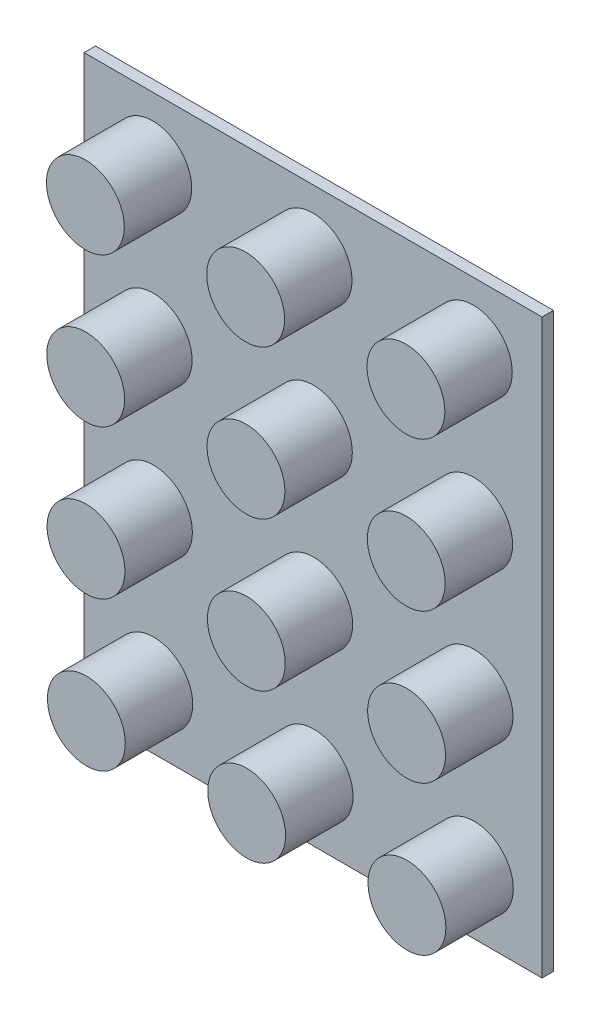
ISO-10303-21;
HEADER;
FILE_DESCRIPTION(('STEP AP214'),'2;1');
FILE_NAME('part.step','',(''),(''),'','','');
FILE_SCHEMA(('AUTOMOTIVE_DESIGN { 1 0 10303 214 1 1 1 1 }'));
ENDSEC;
DATA;
#1=APPLICATION_CONTEXT('core data for automotive mechanical design processes');
#2=APPLICATION_PROTOCOL_DEFINITION('international standard','automotive_design',2000,#1);
#3=PRODUCT_CONTEXT('',#1,'mechanical');
#4=PRODUCT('Part','Part','',(#3));
#5=PRODUCT_RELATED_PRODUCT_CATEGORY('part','',(#4));
#6=PRODUCT_DEFINITION_FORMATION('','',#4);
#7=PRODUCT_DEFINITION_CONTEXT('part definition',#1,'design');
#8=PRODUCT_DEFINITION('design','',#6,#7);
#9=PRODUCT_DEFINITION_SHAPE('','',#8);
#10=(LENGTH_UNIT() NAMED_UNIT(*) SI_UNIT(.MILLI.,.METRE.));
#11=(NAMED_UNIT(*) PLANE_ANGLE_UNIT() SI_UNIT($,.RADIAN.));
#12=(NAMED_UNIT(*) SI_UNIT($,.STERADIAN.) SOLID_ANGLE_UNIT());
#13=UNCERTAINTY_MEASURE_WITH_UNIT(LENGTH_MEASURE(1.E-05),#10,'distance_accuracy_value','');
#14=(GEOMETRIC_REPRESENTATION_CONTEXT(3) GLOBAL_UNCERTAINTY_ASSIGNED_CONTEXT((#13)) GLOBAL_UNIT_ASSIGNED_CONTEXT((#10,
#11,#12)) REPRESENTATION_CONTEXT('',''));
#15=CARTESIAN_POINT('',(0.,0.,0.));
#16=DIRECTION('',(0.,0.,1.));
#17=DIRECTION('',(1.,0.,0.));
#18=AXIS2_PLACEMENT_3D('',#15,#16,#17);
#19=CARTESIAN_POINT('',(14.05873023517,-6.503966793782,6.91));
#20=DIRECTION('',(0.,0.,1.));
#21=DIRECTION('',(1.,0.,0.));
#22=AXIS2_PLACEMENT_3D('',#19,#20,#21);
#23=PLANE('',#22);
#24=CARTESIAN_POINT('',(14.05873023517,-6.503966793782,6.91));
#25=DIRECTION('',(0.,0.,1.));
#26=DIRECTION('',(1.,0.,0.));
#27=AXIS2_PLACEMENT_3D('',#24,#25,#26);
#28=CIRCLE('',#27,3.4);
#29=CARTESIAN_POINT('',(17.45873023517,-6.503966793782,6.91));
#30=VERTEX_POINT('',#29);
#31=EDGE_CURVE('E11',#30,#30,#28,.T.);
#32=ORIENTED_EDGE('',*,*,#31,.T.);
#33=EDGE_LOOP('',(#32));
#34=FACE_BOUND('',#33,.T.);
#35=ADVANCED_FACE('F16',(#34),#23,.T.);
#36=CARTESIAN_POINT('',(14.088113233026,-19.50393358756,6.91));
#37=DIRECTION('',(0.,0.,1.));
#38=DIRECTION('',(1.,0.,0.));
#39=AXIS2_PLACEMENT_3D('',#36,#37,#38);
#40=PLANE('',#39);
#41=CARTESIAN_POINT('',(14.088113233026,-19.50393358756,6.91));
#42=DIRECTION('',(0.,0.,1.));
#43=DIRECTION('',(1.,0.,0.));
#44=AXIS2_PLACEMENT_3D('',#41,#42,#43);
#45=CIRCLE('',#44,3.4);
#46=CARTESIAN_POINT('',(17.488113233026,-19.50393358756,6.91));
#47=VERTEX_POINT('',#46);
#48=EDGE_CURVE('E45',#47,#47,#45,.T.);
#49=ORIENTED_EDGE('',*,*,#48,.T.);
#50=EDGE_LOOP('',(#49));
#51=FACE_BOUND('',#50,.T.);
#52=ADVANCED_FACE('F399',(#51),#40,.T.);
#53=CARTESIAN_POINT('',(14.029347237314,6.496,6.91));
#54=DIRECTION('',(0.,0.,1.));
#55=DIRECTION('',(1.,0.,0.));
#56=AXIS2_PLACEMENT_3D('',#53,#54,#55);
#57=PLANE('',#56);
#58=CARTESIAN_POINT('',(14.029347237314,6.496,6.91));
#59=DIRECTION('',(0.,0.,1.));
#60=DIRECTION('',(1.,0.,0.));
#61=AXIS2_PLACEMENT_3D('',#58,#59,#60);
#62=CIRCLE('',#61,3.4);
#63=CARTESIAN_POINT('',(17.429347237314,6.496,6.91));
#64=VERTEX_POINT('',#63);
#65=EDGE_CURVE('E211',#64,#64,#62,.T.);
#66=ORIENTED_EDGE('',*,*,#65,.T.);
#67=EDGE_LOOP('',(#66));
#68=FACE_BOUND('',#67,.T.);
#69=ADVANCED_FACE('F404',(#68),#57,.T.);
#70=CARTESIAN_POINT('',(13.999964239458,19.495966793782,6.91));
#71=DIRECTION('',(0.,0.,1.));
#72=DIRECTION('',(1.,0.,0.));
#73=AXIS2_PLACEMENT_3D('',#70,#71,#72);
#74=PLANE('',#73);
#75=CARTESIAN_POINT('',(13.999964239458,19.495966793782,6.91));
#76=DIRECTION('',(0.,0.,1.));
#77=DIRECTION('',(1.,0.,0.));
#78=AXIS2_PLACEMENT_3D('',#75,#76,#77);
#79=CIRCLE('',#78,3.4);
#80=CARTESIAN_POINT('',(17.399964239458,19.495966793782,6.91));
#81=VERTEX_POINT('',#80);
#82=EDGE_CURVE('E322',#81,#81,#79,.T.);
#83=ORIENTED_EDGE('',*,*,#82,.T.);
#84=EDGE_LOOP('',(#83));
#85=FACE_BOUND('',#84,.T.);
#86=ADVANCED_FACE('F445',(#85),#74,.T.);
#87=CARTESIAN_POINT('',(0.,19.464323565322,6.91));
#88=DIRECTION('',(0.,0.,1.));
#89=DIRECTION('',(1.,0.,0.));
#90=AXIS2_PLACEMENT_3D('',#87,#88,#89);
#91=PLANE('',#90);
#92=CARTESIAN_POINT('',(0.,19.464323565322,6.91));
#93=DIRECTION('',(0.,0.,1.));
#94=DIRECTION('',(1.,0.,0.));
#95=AXIS2_PLACEMENT_3D('',#92,#93,#94);
#96=CIRCLE('',#95,3.4);
#97=CARTESIAN_POINT('',(3.4,19.464323565322,6.91));
#98=VERTEX_POINT('',#97);
#99=EDGE_CURVE('E238',#98,#98,#96,.T.);
#100=ORIENTED_EDGE('',*,*,#99,.T.);
#101=EDGE_LOOP('',(#100));
#102=FACE_BOUND('',#101,.T.);
#103=ADVANCED_FACE('F437',(#102),#91,.T.);
#104=CARTESIAN_POINT('',(-13.99996423945,19.432680336861,6.91));
#105=DIRECTION('',(0.,0.,1.));
#106=DIRECTION('',(1.,0.,0.));
#107=AXIS2_PLACEMENT_3D('',#104,#105,#106);
#108=PLANE('',#107);
#109=CARTESIAN_POINT('',(-13.99996423945,19.432680336861,6.91));
#110=DIRECTION('',(0.,0.,1.));
#111=DIRECTION('',(1.,0.,0.));
#112=AXIS2_PLACEMENT_3D('',#109,#110,#111);
#113=CIRCLE('',#112,3.4);
#114=CARTESIAN_POINT('',(-10.59996423945,19.432680336861,6.91));
#115=VERTEX_POINT('',#114);
#116=EDGE_CURVE('E231',#115,#115,#113,.T.);
#117=ORIENTED_EDGE('',*,*,#116,.T.);
#118=EDGE_LOOP('',(#117));
#119=FACE_BOUND('',#118,.T.);
#120=ADVANCED_FACE('F435',(#119),#108,.T.);
#121=CARTESIAN_POINT('',(0.08814899356863,-19.53557681602,6.91));
#122=DIRECTION('',(0.,0.,1.));
#123=DIRECTION('',(1.,0.,0.));
#124=AXIS2_PLACEMENT_3D('',#121,#122,#123);
#125=PLANE('',#124);
#126=CARTESIAN_POINT('',(0.08814899356863,-19.53557681602,6.91));
#127=DIRECTION('',(0.,0.,1.));
#128=DIRECTION('',(1.,0.,0.));
#129=AXIS2_PLACEMENT_3D('',#126,#127,#128);
#130=CIRCLE('',#129,3.4);
#131=CARTESIAN_POINT('',(3.488148993569,-19.53557681602,6.91));
#132=VERTEX_POINT('',#131);
#133=EDGE_CURVE('E232',#132,#132,#130,.T.);
#134=ORIENTED_EDGE('',*,*,#133,.T.);
#135=EDGE_LOOP('',(#134));
#136=FACE_BOUND('',#135,.T.);
#137=ADVANCED_FACE('F362',(#136),#125,.T.);
#138=CARTESIAN_POINT('',(0.02938299785621,6.464356771539,6.91));
#139=DIRECTION('',(0.,0.,1.));
#140=DIRECTION('',(1.,0.,0.));
#141=AXIS2_PLACEMENT_3D('',#138,#139,#140);
#142=PLANE('',#141);
#143=CARTESIAN_POINT('',(0.02938299785621,6.464356771539,6.91));
#144=DIRECTION('',(0.,0.,1.));
#145=DIRECTION('',(1.,0.,0.));
#146=AXIS2_PLACEMENT_3D('',#143,#144,#145);
#147=CIRCLE('',#146,3.4);
#148=CARTESIAN_POINT('',(3.429382997856,6.464356771539,6.91));
#149=VERTEX_POINT('',#148);
#150=EDGE_CURVE('E246',#149,#149,#147,.T.);
#151=ORIENTED_EDGE('',*,*,#150,.T.);
#152=EDGE_LOOP('',(#151));
#153=FACE_BOUND('',#152,.T.);
#154=ADVANCED_FACE('F443',(#153),#142,.T.);
#155=CARTESIAN_POINT('',(0.05876599571242,-6.535610022243,6.91));
#156=DIRECTION('',(0.,0.,1.));
#157=DIRECTION('',(1.,0.,0.));
#158=AXIS2_PLACEMENT_3D('',#155,#156,#157);
#159=PLANE('',#158);
#160=CARTESIAN_POINT('',(0.05876599571242,-6.535610022243,6.91));
#161=DIRECTION('',(0.,0.,1.));
#162=DIRECTION('',(1.,0.,0.));
#163=AXIS2_PLACEMENT_3D('',#160,#161,#162);
#164=CIRCLE('',#163,3.4);
#165=CARTESIAN_POINT('',(3.458765995712,-6.535610022243,6.91));
#166=VERTEX_POINT('',#165);
#167=EDGE_CURVE('E311',#166,#166,#164,.T.);
#168=ORIENTED_EDGE('',*,*,#167,.T.);
#169=EDGE_LOOP('',(#168));
#170=FACE_BOUND('',#169,.T.);
#171=ADVANCED_FACE('F464',(#170),#159,.T.);
#172=CARTESIAN_POINT('',(-13.9705812416,6.432713543079,6.91));
#173=DIRECTION('',(0.,0.,1.));
#174=DIRECTION('',(1.,0.,0.));
#175=AXIS2_PLACEMENT_3D('',#172,#173,#174);
#176=PLANE('',#175);
#177=CARTESIAN_POINT('',(-13.9705812416,6.432713543079,6.91));
#178=DIRECTION('',(0.,0.,1.));
#179=DIRECTION('',(1.,0.,0.));
#180=AXIS2_PLACEMENT_3D('',#177,#178,#179);
#181=CIRCLE('',#180,3.4);
#182=CARTESIAN_POINT('',(-10.5705812416,6.432713543079,6.91));
#183=VERTEX_POINT('',#182);
#184=EDGE_CURVE('E222',#183,#183,#181,.T.);
#185=ORIENTED_EDGE('',*,*,#184,.T.);
#186=EDGE_LOOP('',(#185));
#187=FACE_BOUND('',#186,.T.);
#188=ADVANCED_FACE('F408',(#187),#176,.T.);
#189=CARTESIAN_POINT('',(-13.94119824374,-6.567253250703,6.91));
#190=DIRECTION('',(0.,0.,1.));
#191=DIRECTION('',(1.,0.,0.));
#192=AXIS2_PLACEMENT_3D('',#189,#190,#191);
#193=PLANE('',#192);
#194=CARTESIAN_POINT('',(-13.94119824374,-6.567253250703,6.91));
#195=DIRECTION('',(0.,0.,1.));
#196=DIRECTION('',(1.,0.,0.));
#197=AXIS2_PLACEMENT_3D('',#194,#195,#196);
#198=CIRCLE('',#197,3.4);
#199=CARTESIAN_POINT('',(-10.54119824374,-6.567253250703,6.91));
#200=VERTEX_POINT('',#199);
#201=EDGE_CURVE('E300',#200,#200,#198,.T.);
#202=ORIENTED_EDGE('',*,*,#201,.T.);
#203=EDGE_LOOP('',(#202));
#204=FACE_BOUND('',#203,.T.);
#205=ADVANCED_FACE('F471',(#204),#193,.T.);
#206=CARTESIAN_POINT('',(-13.91181524588,-19.56722004448,6.91));
#207=DIRECTION('',(0.,0.,1.));
#208=DIRECTION('',(1.,0.,0.));
#209=AXIS2_PLACEMENT_3D('',#206,#207,#208);
#210=PLANE('',#209);
#211=CARTESIAN_POINT('',(-13.91181524588,-19.56722004448,6.91));
#212=DIRECTION('',(0.,0.,1.));
#213=DIRECTION('',(1.,0.,0.));
#214=AXIS2_PLACEMENT_3D('',#211,#212,#213);
#215=CIRCLE('',#214,3.4);
#216=CARTESIAN_POINT('',(-10.51181524588,-19.56722004448,6.91));
#217=VERTEX_POINT('',#216);
#218=EDGE_CURVE('E98',#217,#217,#215,.T.);
#219=ORIENTED_EDGE('',*,*,#218,.T.);
#220=EDGE_LOOP('',(#219));
#221=FACE_BOUND('',#220,.T.);
#222=ADVANCED_FACE('F482',(#221),#210,.T.);
#223=CARTESIAN_POINT('',(14.05873023517,-6.503966793782,1.02));
#224=DIRECTION('',(0.,0.,-1.));
#225=DIRECTION('',(1.,0.,0.));
#226=AXIS2_PLACEMENT_3D('',#223,#224,#225);
#227=CYLINDRICAL_SURFACE('',#226,3.4);
#228=CARTESIAN_POINT('',(14.05873023517,-6.503966793782,1.02));
#229=DIRECTION('',(0.,0.,1.));
#230=DIRECTION('',(1.,0.,0.));
#231=AXIS2_PLACEMENT_3D('',#228,#229,#230);
#232=CIRCLE('',#231,3.4);
#233=CARTESIAN_POINT('',(17.45873023517,-6.503966793782,1.02));
#234=VERTEX_POINT('',#233);
#235=EDGE_CURVE('E251',#234,#234,#232,.T.);
#236=ORIENTED_EDGE('',*,*,#235,.T.);
#237=DIRECTION('',(0.,0.,1.));
#238=VECTOR('',#237,1.);
#239=CARTESIAN_POINT('',(17.45873023517,-6.503966793782,1.02));
#240=LINE('',#239,#238);
#241=EDGE_CURVE('E26',#234,#30,#240,.T.);
#242=ORIENTED_EDGE('',*,*,#241,.T.);
#243=ORIENTED_EDGE('',*,*,#31,.F.);
#244=ORIENTED_EDGE('',*,*,#241,.F.);
#245=EDGE_LOOP('',(#236,#242,#243,#244));
#246=FACE_BOUND('',#245,.T.);
#247=ADVANCED_FACE('F487',(#246),#227,.T.);
#248=CARTESIAN_POINT('',(14.088113233026,-19.50393358756,1.02));
#249=DIRECTION('',(0.,0.,-1.));
#250=DIRECTION('',(1.,0.,0.));
#251=AXIS2_PLACEMENT_3D('',#248,#249,#250);
#252=CYLINDRICAL_SURFACE('',#251,3.4);
#253=CARTESIAN_POINT('',(14.088113233026,-19.50393358756,1.02));
#254=DIRECTION('',(0.,0.,1.));
#255=DIRECTION('',(1.,0.,0.));
#256=AXIS2_PLACEMENT_3D('',#253,#254,#255);
#257=CIRCLE('',#256,3.4);
#258=CARTESIAN_POINT('',(17.488113233026,-19.50393358756,1.02));
#259=VERTEX_POINT('',#258);
#260=EDGE_CURVE('E255',#259,#259,#257,.T.);
#261=ORIENTED_EDGE('',*,*,#260,.T.);
#262=DIRECTION('',(0.,0.,1.));
#263=VECTOR('',#262,1.);
#264=CARTESIAN_POINT('',(17.488113233026,-19.50393358756,1.02));
#265=LINE('',#264,#263);
#266=EDGE_CURVE('E235',#259,#47,#265,.T.);
#267=ORIENTED_EDGE('',*,*,#266,.T.);
#268=ORIENTED_EDGE('',*,*,#48,.F.);
#269=ORIENTED_EDGE('',*,*,#266,.F.);
#270=EDGE_LOOP('',(#261,#267,#268,#269));
#271=FACE_BOUND('',#270,.T.);
#272=ADVANCED_FACE('F18',(#271),#252,.T.);
#273=CARTESIAN_POINT('',(14.029347237314,6.496,1.02));
#274=DIRECTION('',(0.,0.,-1.));
#275=DIRECTION('',(1.,0.,0.));
#276=AXIS2_PLACEMENT_3D('',#273,#274,#275);
#277=CYLINDRICAL_SURFACE('',#276,3.4);
#278=CARTESIAN_POINT('',(14.029347237314,6.496,1.02));
#279=DIRECTION('',(0.,0.,1.));
#280=DIRECTION('',(1.,0.,0.));
#281=AXIS2_PLACEMENT_3D('',#278,#279,#280);
#282=CIRCLE('',#281,3.4);
#283=CARTESIAN_POINT('',(17.429347237314,6.496,1.02));
#284=VERTEX_POINT('',#283);
#285=EDGE_CURVE('E20',#284,#284,#282,.T.);
#286=ORIENTED_EDGE('',*,*,#285,.T.);
#287=DIRECTION('',(0.,0.,1.));
#288=VECTOR('',#287,1.);
#289=CARTESIAN_POINT('',(17.429347237314,6.496,1.02));
#290=LINE('',#289,#288);
#291=EDGE_CURVE('E319',#284,#64,#290,.T.);
#292=ORIENTED_EDGE('',*,*,#291,.T.);
#293=ORIENTED_EDGE('',*,*,#65,.F.);
#294=ORIENTED_EDGE('',*,*,#291,.F.);
#295=EDGE_LOOP('',(#286,#292,#293,#294));
#296=FACE_BOUND('',#295,.T.);
#297=ADVANCED_FACE('F417',(#296),#277,.T.);
#298=CARTESIAN_POINT('',(13.999964239458,19.495966793782,1.02));
#299=DIRECTION('',(0.,0.,-1.));
#300=DIRECTION('',(1.,0.,0.));
#301=AXIS2_PLACEMENT_3D('',#298,#299,#300);
#302=CYLINDRICAL_SURFACE('',#301,3.4);
#303=CARTESIAN_POINT('',(13.999964239458,19.495966793782,1.02));
#304=DIRECTION('',(0.,0.,1.));
#305=DIRECTION('',(1.,0.,0.));
#306=AXIS2_PLACEMENT_3D('',#303,#304,#305);
#307=CIRCLE('',#306,3.4);
#308=CARTESIAN_POINT('',(17.399964239458,19.495966793782,1.02));
#309=VERTEX_POINT('',#308);
#310=EDGE_CURVE('E303',#309,#309,#307,.T.);
#311=ORIENTED_EDGE('',*,*,#310,.T.);
#312=DIRECTION('',(0.,0.,1.));
#313=VECTOR('',#312,1.);
#314=CARTESIAN_POINT('',(17.399964239458,19.495966793782,1.02));
#315=LINE('',#314,#313);
#316=EDGE_CURVE('E241',#309,#81,#315,.T.);
#317=ORIENTED_EDGE('',*,*,#316,.T.);
#318=ORIENTED_EDGE('',*,*,#82,.F.);
#319=ORIENTED_EDGE('',*,*,#316,.F.);
#320=EDGE_LOOP('',(#311,#317,#318,#319));
#321=FACE_BOUND('',#320,.T.);
#322=ADVANCED_FACE('F414',(#321),#302,.T.);
#323=CARTESIAN_POINT('',(0.,19.464323565322,1.02));
#324=DIRECTION('',(0.,0.,-1.));
#325=DIRECTION('',(1.,0.,0.));
#326=AXIS2_PLACEMENT_3D('',#323,#324,#325);
#327=CYLINDRICAL_SURFACE('',#326,3.4);
#328=CARTESIAN_POINT('',(0.,19.464323565322,1.02));
#329=DIRECTION('',(0.,0.,1.));
#330=DIRECTION('',(1.,0.,0.));
#331=AXIS2_PLACEMENT_3D('',#328,#329,#330);
#332=CIRCLE('',#331,3.4);
#333=CARTESIAN_POINT('',(3.4,19.464323565322,1.02));
#334=VERTEX_POINT('',#333);
#335=EDGE_CURVE('E270',#334,#334,#332,.T.);
#336=ORIENTED_EDGE('',*,*,#335,.T.);
#337=DIRECTION('',(0.,0.,1.));
#338=VECTOR('',#337,1.);
#339=CARTESIAN_POINT('',(3.4,19.464323565322,1.02));
#340=LINE('',#339,#338);
#341=EDGE_CURVE('E242',#334,#98,#340,.T.);
#342=ORIENTED_EDGE('',*,*,#341,.T.);
#343=ORIENTED_EDGE('',*,*,#99,.F.);
#344=ORIENTED_EDGE('',*,*,#341,.F.);
#345=EDGE_LOOP('',(#336,#342,#343,#344));
#346=FACE_BOUND('',#345,.T.);
#347=ADVANCED_FACE('F416',(#346),#327,.T.);
#348=CARTESIAN_POINT('',(-13.99996423945,19.432680336861,1.02));
#349=DIRECTION('',(0.,0.,-1.));
#350=DIRECTION('',(1.,0.,0.));
#351=AXIS2_PLACEMENT_3D('',#348,#349,#350);
#352=CYLINDRICAL_SURFACE('',#351,3.4);
#353=CARTESIAN_POINT('',(-13.99996423945,19.432680336861,1.02));
#354=DIRECTION('',(0.,0.,1.));
#355=DIRECTION('',(1.,0.,0.));
#356=AXIS2_PLACEMENT_3D('',#353,#354,#355);
#357=CIRCLE('',#356,3.4);
#358=CARTESIAN_POINT('',(-10.59996423945,19.432680336861,1.02));
#359=VERTEX_POINT('',#358);
#360=EDGE_CURVE('E266',#359,#359,#357,.T.);
#361=ORIENTED_EDGE('',*,*,#360,.T.);
#362=DIRECTION('',(0.,0.,1.));
#363=VECTOR('',#362,1.);
#364=CARTESIAN_POINT('',(-10.59996423945,19.432680336861,1.02));
#365=LINE('',#364,#363);
#366=EDGE_CURVE('E227',#359,#115,#365,.T.);
#367=ORIENTED_EDGE('',*,*,#366,.T.);
#368=ORIENTED_EDGE('',*,*,#116,.F.);
#369=ORIENTED_EDGE('',*,*,#366,.F.);
#370=EDGE_LOOP('',(#361,#367,#368,#369));
#371=FACE_BOUND('',#370,.T.);
#372=ADVANCED_FACE('F413',(#371),#352,.T.);
#373=CARTESIAN_POINT('',(0.08814899356863,-19.53557681602,1.02));
#374=DIRECTION('',(0.,0.,-1.));
#375=DIRECTION('',(1.,0.,0.));
#376=AXIS2_PLACEMENT_3D('',#373,#374,#375);
#377=CYLINDRICAL_SURFACE('',#376,3.4);
#378=CARTESIAN_POINT('',(0.08814899356863,-19.53557681602,1.02));
#379=DIRECTION('',(0.,0.,1.));
#380=DIRECTION('',(1.,0.,0.));
#381=AXIS2_PLACEMENT_3D('',#378,#379,#380);
#382=CIRCLE('',#381,3.4);
#383=CARTESIAN_POINT('',(3.488148993569,-19.53557681602,1.02));
#384=VERTEX_POINT('',#383);
#385=EDGE_CURVE('E271',#384,#384,#382,.T.);
#386=ORIENTED_EDGE('',*,*,#385,.T.);
#387=DIRECTION('',(0.,0.,1.));
#388=VECTOR('',#387,1.);
#389=CARTESIAN_POINT('',(3.488148993569,-19.53557681602,1.02));
#390=LINE('',#389,#388);
#391=EDGE_CURVE('E248',#384,#132,#390,.T.);
#392=ORIENTED_EDGE('',*,*,#391,.T.);
#393=ORIENTED_EDGE('',*,*,#133,.F.);
#394=ORIENTED_EDGE('',*,*,#391,.F.);
#395=EDGE_LOOP('',(#386,#392,#393,#394));
#396=FACE_BOUND('',#395,.T.);
#397=ADVANCED_FACE('F364',(#396),#377,.T.);
#398=CARTESIAN_POINT('',(0.02938299785621,6.464356771539,1.02));
#399=DIRECTION('',(0.,0.,-1.));
#400=DIRECTION('',(1.,0.,0.));
#401=AXIS2_PLACEMENT_3D('',#398,#399,#400);
#402=CYLINDRICAL_SURFACE('',#401,3.4);
#403=CARTESIAN_POINT('',(0.02938299785621,6.464356771539,1.02));
#404=DIRECTION('',(0.,0.,1.));
#405=DIRECTION('',(1.,0.,0.));
#406=AXIS2_PLACEMENT_3D('',#403,#404,#405);
#407=CIRCLE('',#406,3.4);
#408=CARTESIAN_POINT('',(3.429382997856,6.464356771539,1.02));
#409=VERTEX_POINT('',#408);
#410=EDGE_CURVE('E284',#409,#409,#407,.T.);
#411=ORIENTED_EDGE('',*,*,#410,.T.);
#412=DIRECTION('',(0.,0.,1.));
#413=VECTOR('',#412,1.);
#414=CARTESIAN_POINT('',(3.429382997856,6.464356771539,1.02));
#415=LINE('',#414,#413);
#416=EDGE_CURVE('E249',#409,#149,#415,.T.);
#417=ORIENTED_EDGE('',*,*,#416,.T.);
#418=ORIENTED_EDGE('',*,*,#150,.F.);
#419=ORIENTED_EDGE('',*,*,#416,.F.);
#420=EDGE_LOOP('',(#411,#417,#418,#419));
#421=FACE_BOUND('',#420,.T.);
#422=ADVANCED_FACE('F412',(#421),#402,.T.);
#423=CARTESIAN_POINT('',(0.05876599571242,-6.535610022243,1.02));
#424=DIRECTION('',(0.,0.,-1.));
#425=DIRECTION('',(1.,0.,0.));
#426=AXIS2_PLACEMENT_3D('',#423,#424,#425);
#427=CYLINDRICAL_SURFACE('',#426,3.4);
#428=CARTESIAN_POINT('',(0.05876599571242,-6.535610022243,1.02));
#429=DIRECTION('',(0.,0.,1.));
#430=DIRECTION('',(1.,0.,0.));
#431=AXIS2_PLACEMENT_3D('',#428,#429,#430);
#432=CIRCLE('',#431,3.4);
#433=CARTESIAN_POINT('',(3.458765995712,-6.535610022243,1.02));
#434=VERTEX_POINT('',#433);
#435=EDGE_CURVE('E310',#434,#434,#432,.T.);
#436=ORIENTED_EDGE('',*,*,#435,.T.);
#437=DIRECTION('',(0.,0.,1.));
#438=VECTOR('',#437,1.);
#439=CARTESIAN_POINT('',(3.458765995712,-6.535610022243,1.02));
#440=LINE('',#439,#438);
#441=EDGE_CURVE('E225',#434,#166,#440,.T.);
#442=ORIENTED_EDGE('',*,*,#441,.T.);
#443=ORIENTED_EDGE('',*,*,#167,.F.);
#444=ORIENTED_EDGE('',*,*,#441,.F.);
#445=EDGE_LOOP('',(#436,#442,#443,#444));
#446=FACE_BOUND('',#445,.T.);
#447=ADVANCED_FACE('F452',(#446),#427,.T.);
#448=CARTESIAN_POINT('',(-13.9705812416,6.432713543079,1.02));
#449=DIRECTION('',(0.,0.,-1.));
#450=DIRECTION('',(1.,0.,0.));
#451=AXIS2_PLACEMENT_3D('',#448,#449,#450);
#452=CYLINDRICAL_SURFACE('',#451,3.4);
#453=CARTESIAN_POINT('',(-13.9705812416,6.432713543079,1.02));
#454=DIRECTION('',(0.,0.,1.));
#455=DIRECTION('',(1.,0.,0.));
#456=AXIS2_PLACEMENT_3D('',#453,#454,#455);
#457=CIRCLE('',#456,3.4);
#458=CARTESIAN_POINT('',(-10.5705812416,6.432713543079,1.02));
#459=VERTEX_POINT('',#458);
#460=EDGE_CURVE('E217',#459,#459,#457,.T.);
#461=ORIENTED_EDGE('',*,*,#460,.T.);
#462=DIRECTION('',(0.,0.,1.));
#463=VECTOR('',#462,1.);
#464=CARTESIAN_POINT('',(-10.5705812416,6.432713543079,1.02));
#465=LINE('',#464,#463);
#466=EDGE_CURVE('E226',#459,#183,#465,.T.);
#467=ORIENTED_EDGE('',*,*,#466,.T.);
#468=ORIENTED_EDGE('',*,*,#184,.F.);
#469=ORIENTED_EDGE('',*,*,#466,.F.);
#470=EDGE_LOOP('',(#461,#467,#468,#469));
#471=FACE_BOUND('',#470,.T.);
#472=ADVANCED_FACE('F393',(#471),#452,.T.);
#473=CARTESIAN_POINT('',(-13.94119824374,-6.567253250703,1.02));
#474=DIRECTION('',(0.,0.,-1.));
#475=DIRECTION('',(1.,0.,0.));
#476=AXIS2_PLACEMENT_3D('',#473,#474,#475);
#477=CYLINDRICAL_SURFACE('',#476,3.4);
#478=CARTESIAN_POINT('',(-13.94119824374,-6.567253250703,1.02));
#479=DIRECTION('',(0.,0.,1.));
#480=DIRECTION('',(1.,0.,0.));
#481=AXIS2_PLACEMENT_3D('',#478,#479,#480);
#482=CIRCLE('',#481,3.4);
#483=CARTESIAN_POINT('',(-10.54119824374,-6.567253250703,1.02));
#484=VERTEX_POINT('',#483);
#485=EDGE_CURVE('E213',#484,#484,#482,.T.);
#486=ORIENTED_EDGE('',*,*,#485,.T.);
#487=DIRECTION('',(0.,0.,1.));
#488=VECTOR('',#487,1.);
#489=CARTESIAN_POINT('',(-10.54119824374,-6.567253250703,1.02));
#490=LINE('',#489,#488);
#491=EDGE_CURVE('E294',#484,#200,#490,.T.);
#492=ORIENTED_EDGE('',*,*,#491,.T.);
#493=ORIENTED_EDGE('',*,*,#201,.F.);
#494=ORIENTED_EDGE('',*,*,#491,.F.);
#495=EDGE_LOOP('',(#486,#492,#493,#494));
#496=FACE_BOUND('',#495,.T.);
#497=ADVANCED_FACE('F384',(#496),#477,.T.);
#498=CARTESIAN_POINT('',(-13.91181524588,-19.56722004448,1.02));
#499=DIRECTION('',(0.,0.,-1.));
#500=DIRECTION('',(1.,0.,0.));
#501=AXIS2_PLACEMENT_3D('',#498,#499,#500);
#502=CYLINDRICAL_SURFACE('',#501,3.4);
#503=CARTESIAN_POINT('',(-13.91181524588,-19.56722004448,1.02));
#504=DIRECTION('',(0.,0.,1.));
#505=DIRECTION('',(1.,0.,0.));
#506=AXIS2_PLACEMENT_3D('',#503,#504,#505);
#507=CIRCLE('',#506,3.4);
#508=CARTESIAN_POINT('',(-10.51181524588,-19.56722004448,1.02));
#509=VERTEX_POINT('',#508);
#510=EDGE_CURVE('E218',#509,#509,#507,.T.);
#511=ORIENTED_EDGE('',*,*,#510,.T.);
#512=DIRECTION('',(0.,0.,1.));
#513=VECTOR('',#512,1.);
#514=CARTESIAN_POINT('',(-10.51181524588,-19.56722004448,1.02));
#515=LINE('',#514,#513);
#516=EDGE_CURVE('E254',#509,#217,#515,.T.);
#517=ORIENTED_EDGE('',*,*,#516,.T.);
#518=ORIENTED_EDGE('',*,*,#218,.F.);
#519=ORIENTED_EDGE('',*,*,#516,.F.);
#520=EDGE_LOOP('',(#511,#517,#518,#519));
#521=FACE_BOUND('',#520,.T.);
#522=ADVANCED_FACE('F382',(#521),#502,.T.);
#523=CARTESIAN_POINT('',(20.,-25.,0.02));
#524=DIRECTION('',(0.,-1.,0.));
#525=DIRECTION('',(0.,0.,-1.));
#526=AXIS2_PLACEMENT_3D('',#523,#524,#525);
#527=PLANE('',#526);
#528=DIRECTION('',(0.,0.,1.));
#529=VECTOR('',#528,1.);
#530=CARTESIAN_POINT('',(20.,-25.,0.02));
#531=LINE('',#530,#529);
#532=CARTESIAN_POINT('',(20.,-25.,0.02));
#533=VERTEX_POINT('',#532);
#534=CARTESIAN_POINT('',(20.,-25.,1.02));
#535=VERTEX_POINT('',#534);
#536=EDGE_CURVE('E185',#533,#535,#531,.T.);
#537=ORIENTED_EDGE('',*,*,#536,.T.);
#538=DIRECTION('',(-1.,0.,0.));
#539=VECTOR('',#538,1.);
#540=CARTESIAN_POINT('',(20.,-25.,1.02));
#541=LINE('',#540,#539);
#542=CARTESIAN_POINT('',(-20.,-25.,1.02));
#543=VERTEX_POINT('',#542);
#544=EDGE_CURVE('E180',#535,#543,#541,.T.);
#545=ORIENTED_EDGE('',*,*,#544,.T.);
#546=DIRECTION('',(0.,0.,1.));
#547=VECTOR('',#546,1.);
#548=CARTESIAN_POINT('',(-20.,-25.,0.02));
#549=LINE('',#548,#547);
#550=CARTESIAN_POINT('',(-20.,-25.,0.02));
#551=VERTEX_POINT('',#550);
#552=EDGE_CURVE('E262',#551,#543,#549,.T.);
#553=ORIENTED_EDGE('',*,*,#552,.F.);
#554=DIRECTION('',(-1.,0.,0.));
#555=VECTOR('',#554,1.);
#556=CARTESIAN_POINT('',(20.,-25.,0.02));
#557=LINE('',#556,#555);
#558=EDGE_CURVE('E245',#533,#551,#557,.T.);
#559=ORIENTED_EDGE('',*,*,#558,.F.);
#560=EDGE_LOOP('',(#537,#545,#553,#559));
#561=FACE_BOUND('',#560,.T.);
#562=ADVANCED_FACE('F370',(#561),#527,.T.);
#563=CARTESIAN_POINT('',(0.,0.,1.02));
#564=DIRECTION('',(0.,0.,-1.));
#565=DIRECTION('',(0.,-1.,0.));
#566=AXIS2_PLACEMENT_3D('',#563,#564,#565);
#567=PLANE('',#566);
#568=ORIENTED_EDGE('',*,*,#235,.F.);
#569=EDGE_LOOP('',(#568));
#570=FACE_BOUND('',#569,.T.);
#571=ORIENTED_EDGE('',*,*,#260,.F.);
#572=EDGE_LOOP('',(#571));
#573=FACE_BOUND('',#572,.T.);
#574=ORIENTED_EDGE('',*,*,#285,.F.);
#575=EDGE_LOOP('',(#574));
#576=FACE_BOUND('',#575,.T.);
#577=ORIENTED_EDGE('',*,*,#310,.F.);
#578=EDGE_LOOP('',(#577));
#579=FACE_BOUND('',#578,.T.);
#580=ORIENTED_EDGE('',*,*,#335,.F.);
#581=EDGE_LOOP('',(#580));
#582=FACE_BOUND('',#581,.T.);
#583=ORIENTED_EDGE('',*,*,#360,.F.);
#584=EDGE_LOOP('',(#583));
#585=FACE_BOUND('',#584,.T.);
#586=ORIENTED_EDGE('',*,*,#385,.F.);
#587=EDGE_LOOP('',(#586));
#588=FACE_BOUND('',#587,.T.);
#589=ORIENTED_EDGE('',*,*,#410,.F.);
#590=EDGE_LOOP('',(#589));
#591=FACE_BOUND('',#590,.T.);
#592=ORIENTED_EDGE('',*,*,#435,.F.);
#593=EDGE_LOOP('',(#592));
#594=FACE_BOUND('',#593,.T.);
#595=ORIENTED_EDGE('',*,*,#460,.F.);
#596=EDGE_LOOP('',(#595));
#597=FACE_BOUND('',#596,.T.);
#598=ORIENTED_EDGE('',*,*,#485,.F.);
#599=EDGE_LOOP('',(#598));
#600=FACE_BOUND('',#599,.T.);
#601=ORIENTED_EDGE('',*,*,#510,.F.);
#602=EDGE_LOOP('',(#601));
#603=FACE_BOUND('',#602,.T.);
#604=DIRECTION('',(0.,1.,0.));
#605=VECTOR('',#604,1.);
#606=CARTESIAN_POINT('',(-20.,-25.,1.02));
#607=LINE('',#606,#605);
#608=CARTESIAN_POINT('',(-20.,25.,1.02));
#609=VERTEX_POINT('',#608);
#610=EDGE_CURVE('E221',#543,#609,#607,.T.);
#611=ORIENTED_EDGE('',*,*,#610,.F.);
#612=ORIENTED_EDGE('',*,*,#544,.F.);
#613=DIRECTION('',(0.,-1.,0.));
#614=VECTOR('',#613,1.);
#615=CARTESIAN_POINT('',(20.,25.,1.02));
#616=LINE('',#615,#614);
#617=CARTESIAN_POINT('',(20.,25.,1.02));
#618=VERTEX_POINT('',#617);
#619=EDGE_CURVE('E173',#618,#535,#616,.T.);
#620=ORIENTED_EDGE('',*,*,#619,.F.);
#621=DIRECTION('',(1.,0.,0.));
#622=VECTOR('',#621,1.);
#623=CARTESIAN_POINT('',(-20.,25.,1.02));
#624=LINE('',#623,#622);
#625=EDGE_CURVE('E178',#609,#618,#624,.T.);
#626=ORIENTED_EDGE('',*,*,#625,.F.);
#627=EDGE_LOOP('',(#611,#612,#620,#626));
#628=FACE_BOUND('',#627,.T.);
#629=ADVANCED_FACE('F176',(#570,#573,#576,#579,#582,#585,#588,#591,#594,#597,#600,#603,#628),
#567,.F.);
#630=CARTESIAN_POINT('',(0.,0.,0.02));
#631=DIRECTION('',(0.,0.,-1.));
#632=DIRECTION('',(0.,-1.,0.));
#633=AXIS2_PLACEMENT_3D('',#630,#631,#632);
#634=PLANE('',#633);
#635=DIRECTION('',(1.,0.,0.));
#636=VECTOR('',#635,1.);
#637=CARTESIAN_POINT('',(-20.,25.,0.02));
#638=LINE('',#637,#636);
#639=CARTESIAN_POINT('',(-20.,25.,0.02));
#640=VERTEX_POINT('',#639);
#641=CARTESIAN_POINT('',(20.,25.,0.02));
#642=VERTEX_POINT('',#641);
#643=EDGE_CURVE('E197',#640,#642,#638,.T.);
#644=ORIENTED_EDGE('',*,*,#643,.T.);
#645=DIRECTION('',(0.,-1.,0.));
#646=VECTOR('',#645,1.);
#647=CARTESIAN_POINT('',(20.,25.,0.02));
#648=LINE('',#647,#646);
#649=EDGE_CURVE('E192',#642,#533,#648,.T.);
#650=ORIENTED_EDGE('',*,*,#649,.T.);
#651=ORIENTED_EDGE('',*,*,#558,.T.);
#652=DIRECTION('',(0.,1.,0.));
#653=VECTOR('',#652,1.);
#654=CARTESIAN_POINT('',(-20.,-25.,0.02));
#655=LINE('',#654,#653);
#656=EDGE_CURVE('E186',#551,#640,#655,.T.);
#657=ORIENTED_EDGE('',*,*,#656,.T.);
#658=EDGE_LOOP('',(#644,#650,#651,#657));
#659=FACE_BOUND('',#658,.T.);
#660=ADVANCED_FACE('F369',(#659),#634,.T.);
#661=CARTESIAN_POINT('',(20.,25.,0.02));
#662=DIRECTION('',(1.,0.,0.));
#663=DIRECTION('',(0.,1.,0.));
#664=AXIS2_PLACEMENT_3D('',#661,#662,#663);
#665=PLANE('',#664);
#666=DIRECTION('',(0.,0.,1.));
#667=VECTOR('',#666,1.);
#668=CARTESIAN_POINT('',(20.,25.,0.02));
#669=LINE('',#668,#667);
#670=EDGE_CURVE('E189',#642,#618,#669,.T.);
#671=ORIENTED_EDGE('',*,*,#670,.T.);
#672=ORIENTED_EDGE('',*,*,#619,.T.);
#673=ORIENTED_EDGE('',*,*,#536,.F.);
#674=ORIENTED_EDGE('',*,*,#649,.F.);
#675=EDGE_LOOP('',(#671,#672,#673,#674));
#676=FACE_BOUND('',#675,.T.);
#677=ADVANCED_FACE('F190',(#676),#665,.T.);
#678=CARTESIAN_POINT('',(-20.,-25.,0.02));
#679=DIRECTION('',(-1.,0.,0.));
#680=DIRECTION('',(0.,0.,1.));
#681=AXIS2_PLACEMENT_3D('',#678,#679,#680);
#682=PLANE('',#681);
#683=ORIENTED_EDGE('',*,*,#552,.T.);
#684=ORIENTED_EDGE('',*,*,#610,.T.);
#685=DIRECTION('',(0.,0.,1.));
#686=VECTOR('',#685,1.);
#687=CARTESIAN_POINT('',(-20.,25.,0.02));
#688=LINE('',#687,#686);
#689=EDGE_CURVE('E201',#640,#609,#688,.T.);
#690=ORIENTED_EDGE('',*,*,#689,.F.);
#691=ORIENTED_EDGE('',*,*,#656,.F.);
#692=EDGE_LOOP('',(#683,#684,#690,#691));
#693=FACE_BOUND('',#692,.T.);
#694=ADVANCED_FACE('F451',(#693),#682,.T.);
#695=CARTESIAN_POINT('',(-20.,25.,0.02));
#696=DIRECTION('',(0.,1.,0.));
#697=DIRECTION('',(1.,0.,0.));
#698=AXIS2_PLACEMENT_3D('',#695,#696,#697);
#699=PLANE('',#698);
#700=ORIENTED_EDGE('',*,*,#689,.T.);
#701=ORIENTED_EDGE('',*,*,#625,.T.);
#702=ORIENTED_EDGE('',*,*,#670,.F.);
#703=ORIENTED_EDGE('',*,*,#643,.F.);
#704=EDGE_LOOP('',(#700,#701,#702,#703));
#705=FACE_BOUND('',#704,.T.);
#706=ADVANCED_FACE('F199',(#705),#699,.T.);
#707=CLOSED_SHELL('',(#35,#52,#69,#86,#103,#120,#137,#154,#171,#188,#205,#222,#247,#272,#297,
#322,#347,#372,#397,#422,#447,#472,#497,#522,#562,#629,#660,#677,#694,#706));
#708=MANIFOLD_SOLID_BREP('B1',#707);
#709=ADVANCED_BREP_SHAPE_REPRESENTATION('',(#18,#708),#14);
#710=SHAPE_DEFINITION_REPRESENTATION(#9,#709);
ENDSEC;
END-ISO-10303-21;
